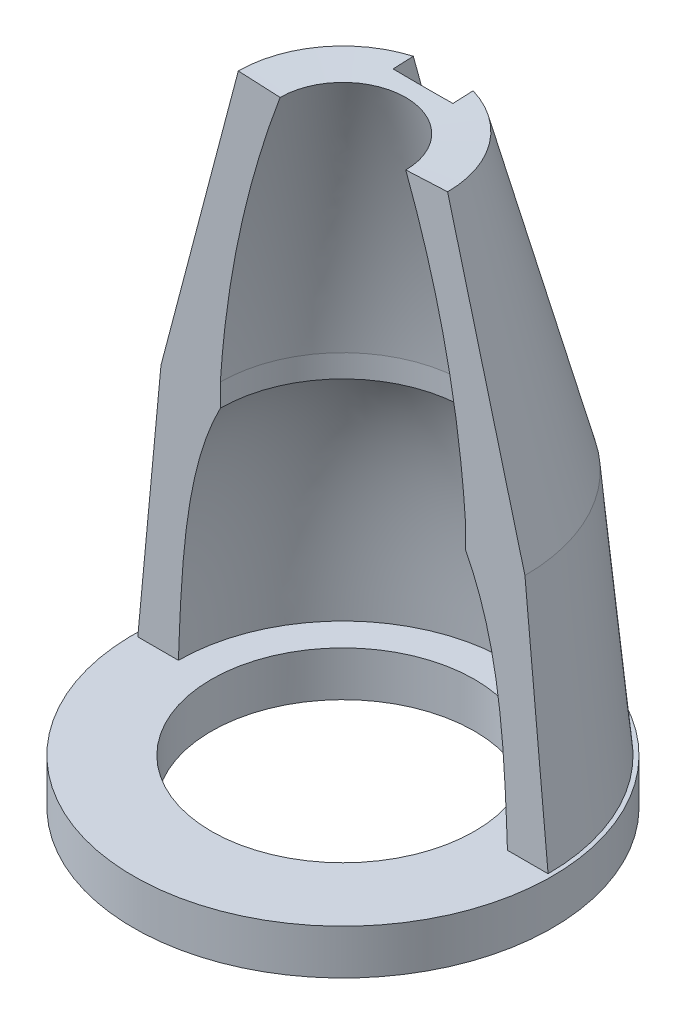
ISO-10303-21;
HEADER;
FILE_DESCRIPTION(('STEP AP214'),'2;1');
FILE_NAME('part.step','',(''),(''),'','','');
FILE_SCHEMA(('AUTOMOTIVE_DESIGN { 1 0 10303 214 1 1 1 1 }'));
ENDSEC;
DATA;
#1=APPLICATION_CONTEXT('core data for automotive mechanical design processes');
#2=APPLICATION_PROTOCOL_DEFINITION('international standard','automotive_design',2000,#1);
#3=PRODUCT_CONTEXT('',#1,'mechanical');
#4=PRODUCT('Part','Part','',(#3));
#5=PRODUCT_RELATED_PRODUCT_CATEGORY('part','',(#4));
#6=PRODUCT_DEFINITION_FORMATION('','',#4);
#7=PRODUCT_DEFINITION_CONTEXT('part definition',#1,'design');
#8=PRODUCT_DEFINITION('design','',#6,#7);
#9=PRODUCT_DEFINITION_SHAPE('','',#8);
#10=(LENGTH_UNIT() NAMED_UNIT(*) SI_UNIT(.MILLI.,.METRE.));
#11=(NAMED_UNIT(*) PLANE_ANGLE_UNIT() SI_UNIT($,.RADIAN.));
#12=(NAMED_UNIT(*) SI_UNIT($,.STERADIAN.) SOLID_ANGLE_UNIT());
#13=UNCERTAINTY_MEASURE_WITH_UNIT(LENGTH_MEASURE(1.E-05),#10,'distance_accuracy_value','');
#14=(GEOMETRIC_REPRESENTATION_CONTEXT(3) GLOBAL_UNCERTAINTY_ASSIGNED_CONTEXT((#13)) GLOBAL_UNIT_ASSIGNED_CONTEXT((#10,
#11,#12)) REPRESENTATION_CONTEXT('',''));
#15=CARTESIAN_POINT('',(0.,0.,0.));
#16=DIRECTION('',(0.,0.,1.));
#17=DIRECTION('',(1.,0.,0.));
#18=AXIS2_PLACEMENT_3D('',#15,#16,#17);
#19=CARTESIAN_POINT('',(0.,9.74930861182992,0.));
#20=DIRECTION('',(0.,-1.,0.));
#21=DIRECTION('',(0.,0.,-1.));
#22=AXIS2_PLACEMENT_3D('',#19,#20,#21);
#23=CONICAL_SURFACE('',#22,6.08440046766459,0.257573905962779);
#24=CARTESIAN_POINT('',(0.,19.5659579235041,0.));
#25=DIRECTION('',(0.,-1.,0.));
#26=DIRECTION('',(0.,0.,-1.));
#27=AXIS2_PLACEMENT_3D('',#24,#25,#26);
#28=CIRCLE('',#27,3.49844540555827);
#29=CARTESIAN_POINT('',(-3.49844540555827,19.5659579235041,0.));
#30=VERTEX_POINT('',#29);
#31=CARTESIAN_POINT('',(-1.,19.5659579235041,-3.35247971741393));
#32=VERTEX_POINT('',#31);
#33=EDGE_CURVE('E324',#30,#32,#28,.T.);
#34=ORIENTED_EDGE('',*,*,#33,.T.);
#35=CARTESIAN_POINT('',(-1.,1.59736562952712,8.17086395291741));
#36=CARTESIAN_POINT('',(-1.,2.65581479317755,7.8899438466046));
#37=CARTESIAN_POINT('',(-1.,3.71421910526494,7.60885422320191));
#38=CARTESIAN_POINT('',(-1.,5.83091224108039,7.0461050256498));
#39=CARTESIAN_POINT('',(-1.,6.8892010600612,6.76444543364683));
#40=CARTESIAN_POINT('',(-1.,9.00233260573966,6.20120615008545));
#41=CARTESIAN_POINT('',(-1.,10.0571759698104,5.91962885044428));
#42=CARTESIAN_POINT('',(-1.,12.1665160028534,5.35530733737491));
#43=CARTESIAN_POINT('',(-1.,13.2210126815091,5.0725631601803));
#44=CARTESIAN_POINT('',(-1.,15.0459133065507,4.58146423670634));
#45=CARTESIAN_POINT('',(-1.,15.8164377232071,4.3735572983072));
#46=CARTESIAN_POINT('',(-1.,17.357130458585,3.9561742214183));
#47=CARTESIAN_POINT('',(-1.,18.1272987426996,3.74669795493429));
#48=CARTESIAN_POINT('',(-1.,19.283011686943,3.43030638536026));
#49=CARTESIAN_POINT('',(-1.,19.6688169704537,3.32434353402257));
#50=CARTESIAN_POINT('',(-1.,20.4401908888034,3.11156038696217));
#51=CARTESIAN_POINT('',(-1.,20.8257595238109,3.00474009185115));
#52=CARTESIAN_POINT('',(-1.,21.5964705959809,2.78996406923584));
#53=CARTESIAN_POINT('',(-1.,21.9816131191467,2.68200865086172));
#54=CARTESIAN_POINT('',(-1.,22.7514274274367,2.46444565502901));
#55=CARTESIAN_POINT('',(-1.,23.1360992173402,2.35483809449763));
#56=CARTESIAN_POINT('',(-1.,23.9050602683575,2.13308453982012));
#57=CARTESIAN_POINT('',(-1.,24.2893489472598,2.02093651494733));
#58=CARTESIAN_POINT('',(-1.,24.8650472593894,1.84968242406842));
#59=CARTESIAN_POINT('',(-1.,25.0569003962659,1.79206886901678));
#60=CARTESIAN_POINT('',(-1.,25.4401906226309,1.67551333823383));
#61=CARTESIAN_POINT('',(-1.,25.6316277378972,1.61657144754172));
#62=CARTESIAN_POINT('',(-1.,26.0132650308753,1.49708294523809));
#63=CARTESIAN_POINT('',(-1.,26.2034671922711,1.43654268174371));
#64=CARTESIAN_POINT('',(-1.,26.5830939911822,1.31289144150961));
#65=CARTESIAN_POINT('',(-1.,26.7725184255981,1.24977983510996));
#66=CARTESIAN_POINT('',(-1.,27.0555227814339,1.1522124090513));
#67=CARTESIAN_POINT('',(-1.,27.1496094609985,1.11922846206743));
#68=CARTESIAN_POINT('',(-1.,27.3373299367616,1.05199885243392));
#69=CARTESIAN_POINT('',(-1.,27.4309637464336,1.01775322758538));
#70=CARTESIAN_POINT('',(-1.,27.6175725161607,0.947618629059525));
#71=CARTESIAN_POINT('',(-1.,27.7105477273507,0.911730325578836));
#72=CARTESIAN_POINT('',(-1.,27.8955928089887,0.837699605368933));
#73=CARTESIAN_POINT('',(-1.,27.9876628110541,0.799557522166223));
#74=CARTESIAN_POINT('',(-1.,28.1149603301852,0.744122129188133));
#75=CARTESIAN_POINT('',(-1.,28.1507917585206,0.728216078192626));
#76=CARTESIAN_POINT('',(-1.,28.2221811160255,0.695792557199093));
#77=CARTESIAN_POINT('',(-1.,28.2577390195709,0.679275030740112));
#78=CARTESIAN_POINT('',(-1.,28.3639384278884,0.628623160375121));
#79=CARTESIAN_POINT('',(-1.,28.4340687423826,0.593405311256645));
#80=CARTESIAN_POINT('',(-1.,28.5673174912212,0.521203502611795));
#81=CARTESIAN_POINT('',(-1.,28.6305864667807,0.484507548657398));
#82=CARTESIAN_POINT('',(-1.,28.7226069352826,0.424833248916426));
#83=CARTESIAN_POINT('',(-1.,28.7528312418735,0.404145042904418));
#84=CARTESIAN_POINT('',(-1.,28.8117426580728,0.3607040580166));
#85=CARTESIAN_POINT('',(-1.,28.840431383961,0.337953520632389));
#86=CARTESIAN_POINT('',(-1.,28.8957077274827,0.289334265110898));
#87=CARTESIAN_POINT('',(-1.,28.9222647414958,0.263430253827442));
#88=CARTESIAN_POINT('',(-1.,28.9707739450115,0.207666063401883));
#89=CARTESIAN_POINT('',(-1.,28.9927614121425,0.177839336527438));
#90=CARTESIAN_POINT('',(-1.,29.0183465969364,0.131026100614901));
#91=CARTESIAN_POINT('',(-1.,29.0254162509004,0.115969692344692));
#92=CARTESIAN_POINT('',(-1.,29.0371858920895,0.0849479585539478));
#93=CARTESIAN_POINT('',(-1.,29.0418883259105,0.0689835905158777));
#94=CARTESIAN_POINT('',(-1.,29.0484162607216,0.0362975679000318));
#95=CARTESIAN_POINT('',(-1.,29.0502139261186,0.0195701476017675));
#96=CARTESIAN_POINT('',(-1.,29.0505723188851,-0.0139212100134694));
#97=CARTESIAN_POINT('',(-1.,29.0491332049211,-0.0306851455002256));
#98=CARTESIAN_POINT('',(-1.,29.0435433648495,-0.06196601172763));
#99=CARTESIAN_POINT('',(-1.,29.0396845176397,-0.0765375991467143));
#100=CARTESIAN_POINT('',(-1.,29.0299295012471,-0.104971903732398));
#101=CARTESIAN_POINT('',(-1.,29.0240322897983,-0.1188342540775));
#102=CARTESIAN_POINT('',(-1.,29.0055127304719,-0.156041867479906));
#103=CARTESIAN_POINT('',(-1.,28.9911956344389,-0.178535167169328));
#104=CARTESIAN_POINT('',(-1.,28.9594519307908,-0.221212467860429));
#105=CARTESIAN_POINT('',(-1.,28.9420134144246,-0.241387120955779));
#106=CARTESIAN_POINT('',(-1.,28.8969830563985,-0.288431447871601));
#107=CARTESIAN_POINT('',(-1.,28.8683324051545,-0.314272421634982));
#108=CARTESIAN_POINT('',(-1.,28.8087365384255,-0.363196308592947));
#109=CARTESIAN_POINT('',(-1.,28.777785975982,-0.386272446873958));
#110=CARTESIAN_POINT('',(-1.,28.7142836425353,-0.430521784200716));
#111=CARTESIAN_POINT('',(-1.,28.681723205757,-0.451682427128373));
#112=CARTESIAN_POINT('',(-1.,28.6156941820293,-0.492421782998218));
#113=CARTESIAN_POINT('',(-1.,28.5822267449263,-0.51200238423207));
#114=CARTESIAN_POINT('',(-1.,28.472651524924,-0.573573130774992));
#115=CARTESIAN_POINT('',(-1.,28.3952156168386,-0.613188023375372));
#116=CARTESIAN_POINT('',(-1.,28.2385793715012,-0.688790200872645));
#117=CARTESIAN_POINT('',(-1.,28.1593778171492,-0.724774882647809));
#118=CARTESIAN_POINT('',(-1.,27.9997013149153,-0.794319374942134));
#119=CARTESIAN_POINT('',(-1.,27.9192238270734,-0.827873331750471));
#120=CARTESIAN_POINT('',(-1.,27.7575677635494,-0.893156914301305));
#121=CARTESIAN_POINT('',(-1.,27.6763894109428,-0.92488709756774));
#122=CARTESIAN_POINT('',(-1.,27.5135717361275,-0.98695634022298));
#123=CARTESIAN_POINT('',(-1.,27.4319327902324,-1.01729639019937));
#124=CARTESIAN_POINT('',(-1.,27.2682622589641,-1.07691385873241));
#125=CARTESIAN_POINT('',(-1.,27.1862306445427,-1.10619119725415));
#126=CARTESIAN_POINT('',(-1.,27.0219838685205,-1.163854581408));
#127=CARTESIAN_POINT('',(-1.,26.9397691223436,-1.19224181290881));
#128=CARTESIAN_POINT('',(-1.,26.7751062186691,-1.24832164738761));
#129=CARTESIAN_POINT('',(-1.,26.6926580679848,-1.27601427041421));
#130=CARTESIAN_POINT('',(-1.,26.4463481695884,-1.35779815628005));
#131=CARTESIAN_POINT('',(-1.,26.2822082432315,-1.41105147735648));
#132=CARTESIAN_POINT('',(-1.,25.9534134268894,-1.5159468254333));
#133=CARTESIAN_POINT('',(-1.,25.788758526161,-1.56758881856896));
#134=CARTESIAN_POINT('',(-1.,25.2942184621035,-1.72073435838425));
#135=CARTESIAN_POINT('',(-1.,24.9637804048912,-1.82045015018727));
#136=CARTESIAN_POINT('',(-1.,24.3018146239546,-2.01707265538576));
#137=CARTESIAN_POINT('',(-1.,23.9702862816997,-2.11397726907767));
#138=CARTESIAN_POINT('',(-1.,23.3066847855066,-2.30585080421032));
#139=CARTESIAN_POINT('',(-1.,22.9746116536514,-2.4008198021138));
#140=CARTESIAN_POINT('',(-1.,22.3106495012682,-2.5892468400219));
#141=CARTESIAN_POINT('',(-1.,21.9787611318818,-2.68270717976484));
#142=CARTESIAN_POINT('',(-1.,21.3147047169263,-2.86864098330493));
#143=CARTESIAN_POINT('',(-1.,20.9825366685703,-2.9611144371397));
#144=CARTESIAN_POINT('',(-1.,19.9859228616788,-3.23737750993922));
#145=CARTESIAN_POINT('',(-1.,19.3211718052259,-3.42006500426242));
#146=CARTESIAN_POINT('',(-1.,17.8492790408652,-3.82245813232542));
#147=CARTESIAN_POINT('',(-1.,17.0420228908798,-4.04174414556835));
#148=CARTESIAN_POINT('',(-1.,15.4270772238621,-4.47871990123849));
#149=CARTESIAN_POINT('',(-1.,14.6193877058832,-4.69640964016443));
#150=CARTESIAN_POINT('',(-1.,13.003624554938,-5.13076662003794));
#151=CARTESIAN_POINT('',(-1.,12.195550886334,-5.3474337283251));
#152=CARTESIAN_POINT('',(-1.,10.5792090186622,-5.78004121159687));
#153=CARTESIAN_POINT('',(-1.,9.77094081957183,-5.99598158649754));
#154=CARTESIAN_POINT('',(-1.,8.15265545501148,-6.42776758895207));
#155=CARTESIAN_POINT('',(-1.,7.34263801096158,-6.64361217213717));
#156=CARTESIAN_POINT('',(-1.,5.72249856165326,-7.07490939286829));
#157=CARTESIAN_POINT('',(-1.,4.91237655636603,-7.29036203030603));
#158=CARTESIAN_POINT('',(-1.,3.29216287235672,-7.72093931242668));
#159=CARTESIAN_POINT('',(-1.,2.48207120438845,-7.93606399758119));
#160=CARTESIAN_POINT('',(-1.,0.861825221954424,-8.36607611551925));
#161=CARTESIAN_POINT('',(-1.,0.0516709075121448,-8.58096354839122));
#162=CARTESIAN_POINT('',(-1.,-0.75850666456266,-8.79576318447279));
#163=B_SPLINE_CURVE_WITH_KNOTS('',3,(#35,#36,#37,#38,#39,#40,#41,#42,#43,#44,#45,#46,#47,#48,
#49,#50,#51,#52,#53,#54,#55,#56,#57,#58,#59,#60,#61,#62,#63,#64,#65,#66,#67,#68,#69,#70,#71,#72,
#73,#74,#75,#76,#77,#78,#79,#80,#81,#82,#83,#84,#85,#86,#87,#88,#89,#90,#91,#92,#93,#94,#95,#96,
#97,#98,#99,#100,#101,#102,#103,#104,#105,#106,#107,#108,#109,#110,#111,#112,#113,#114,#115,
#116,#117,#118,#119,#120,#121,#122,#123,#124,#125,#126,#127,#128,#129,#130,#131,#132,#133,#134,
#135,#136,#137,#138,#139,#140,#141,#142,#143,#144,#145,#146,#147,#148,#149,#150,#151,#152,#153,
#154,#155,#156,#157,#158,#159,#160,#161,#162),.UNSPECIFIED.,.F.,.F.,(4,2,2,2,2,2,2,2,2,2,2,2,2,
2,2,2,2,2,2,2,2,2,2,2,2,2,2,2,2,2,2,2,2,2,2,2,2,2,2,2,2,2,2,2,2,2,2,2,2,2,2,2,2,2,2,2,2,2,2,2,2,
2,2,4),(0.,3.28528201965727,6.57066859081754,9.84600374826942,13.1212379547922,15.5154799493153,
17.9099193913156,19.1101955494143,20.3104708513309,21.5104273360822,22.7103715348884,
23.9113113489673,24.5122594209438,25.1131691292835,25.7119728076043,26.3109240103574,
26.610019979206,26.9091069941223,27.2080730536215,27.5069949807755,27.6245999434365,
27.7422157924407,27.9775677782348,28.1967348240543,28.3065576394288,28.4162624906756,
28.5273330893305,28.6375114373154,28.6872596087236,28.7369562577369,28.7871263708053,
28.8372940245916,28.8823392039849,28.9274074502487,29.006929052421,29.0867607734272,
29.2022088691137,29.3179343095752,29.4343704159261,29.5506652437667,29.8114141012395,
30.0723486248167,30.3338919715925,30.5953549351339,30.8566285905307,31.1179218823111,
31.3788508346829,31.6397722471268,32.1574464105727,32.6751314464767,33.7105723969808,
34.7467677957353,35.782922181963,36.8173102458488,37.8517087417907,39.9198959460724,
42.4294233577757,44.9389562722251,47.4488062487425,49.9586565151591,52.4735031615768,
54.9883505025708,57.5028572277418,60.0173630153837),.UNSPECIFIED.);
#164=CARTESIAN_POINT('',(-1.,9.74930861182994,-6.00166052446463));
#165=VERTEX_POINT('',#164);
#166=EDGE_CURVE('E49',#32,#165,#163,.T.);
#167=ORIENTED_EDGE('',*,*,#166,.T.);
#168=CARTESIAN_POINT('',(0.,9.74930861182992,0.));
#169=DIRECTION('',(0.,-1.,0.));
#170=DIRECTION('',(0.,0.,-1.));
#171=AXIS2_PLACEMENT_3D('',#168,#169,#170);
#172=CIRCLE('',#171,6.08440046766459);
#173=CARTESIAN_POINT('',(-6.08440046766459,9.74930861182992,0.));
#174=VERTEX_POINT('',#173);
#175=EDGE_CURVE('E212',#174,#165,#172,.T.);
#176=ORIENTED_EDGE('',*,*,#175,.F.);
#177=DIRECTION('',(0.254735244649564,0.967010835065113,0.));
#178=VECTOR('',#177,1.);
#179=CARTESIAN_POINT('',(-6.08440046766459,9.74930861182992,0.));
#180=LINE('',#179,#178);
#181=EDGE_CURVE('E264',#174,#30,#180,.T.);
#182=ORIENTED_EDGE('',*,*,#181,.T.);
#183=EDGE_LOOP('',(#34,#167,#176,#182));
#184=FACE_BOUND('',#183,.T.);
#185=ADVANCED_FACE('F33',(#184),#23,.T.);
#186=CARTESIAN_POINT('',(0.,0.,0.));
#187=DIRECTION('',(0.,-1.,0.));
#188=DIRECTION('',(0.,0.,-1.));
#189=AXIS2_PLACEMENT_3D('',#186,#187,#188);
#190=CONICAL_SURFACE('',#189,7.,0.0936396511303337);
#191=CARTESIAN_POINT('',(1.,14.969992515671,-5.50399807245972));
#192=CARTESIAN_POINT('',(1.,13.2724525543383,-5.66602543122509));
#193=CARTESIAN_POINT('',(1.,11.5748920773463,-5.82783764689055));
#194=CARTESIAN_POINT('',(1.,8.1797374498491,-6.15110805088424));
#195=CARTESIAN_POINT('',(1.,6.4821432993447,-6.31256623922032));
#196=CARTESIAN_POINT('',(1.,3.82979410705182,-6.56461223587331));
#197=CARTESIAN_POINT('',(1.,2.8750480870203,-6.6552949970699));
#198=CARTESIAN_POINT('',(1.,1.92029854436637,-6.74594061357374));
#199=B_SPLINE_CURVE_WITH_KNOTS('',3,(#191,#192,#193,#194,#195,#196,#197,#198),.UNSPECIFIED.,.F.,
.F.,(4,2,2,4),(0.,5.11576510781106,10.231530102274,13.1086588610301),.UNSPECIFIED.);
#200=CARTESIAN_POINT('',(1.,9.74930861182994,-6.00166052446463));
#201=VERTEX_POINT('',#200);
#202=CARTESIAN_POINT('',(1.,7.14098244820744,-6.24986343805771));
#203=VERTEX_POINT('',#202);
#204=EDGE_CURVE('E207',#201,#203,#199,.T.);
#205=ORIENTED_EDGE('',*,*,#204,.F.);
#206=CARTESIAN_POINT('',(6.08440046766459,9.74930861182992,0.));
#207=VERTEX_POINT('',#206);
#208=EDGE_CURVE('E322',#201,#207,#172,.T.);
#209=ORIENTED_EDGE('',*,*,#208,.T.);
#210=DIRECTION('',(-0.0935028663726001,0.995619010455359,0.));
#211=VECTOR('',#210,1.);
#212=CARTESIAN_POINT('',(7.,0.,0.));
#213=LINE('',#212,#211);
#214=CARTESIAN_POINT('',(6.85912854406551,1.5,0.));
#215=VERTEX_POINT('',#214);
#216=EDGE_CURVE('E236',#215,#207,#213,.T.);
#217=ORIENTED_EDGE('',*,*,#216,.F.);
#218=CARTESIAN_POINT('',(0.,1.5,0.));
#219=DIRECTION('',(0.,-1.,0.));
#220=DIRECTION('',(0.,0.,-1.));
#221=AXIS2_PLACEMENT_3D('',#218,#219,#220);
#222=CIRCLE('',#221,6.85912854406551);
#223=CARTESIAN_POINT('',(-6.85912854406551,1.5,0.));
#224=VERTEX_POINT('',#223);
#225=EDGE_CURVE('E233',#215,#224,#222,.F.);
#226=ORIENTED_EDGE('',*,*,#225,.T.);
#227=DIRECTION('',(0.0935028663726001,0.995619010455359,0.));
#228=VECTOR('',#227,1.);
#229=CARTESIAN_POINT('',(-7.,0.,0.));
#230=LINE('',#229,#228);
#231=EDGE_CURVE('E259',#224,#174,#230,.T.);
#232=ORIENTED_EDGE('',*,*,#231,.T.);
#233=ORIENTED_EDGE('',*,*,#175,.T.);
#234=CARTESIAN_POINT('',(-1.,14.969992515671,-5.50399807245971));
#235=CARTESIAN_POINT('',(-1.,13.2724525543384,-5.66602543122508));
#236=CARTESIAN_POINT('',(-1.,11.5748920773463,-5.82783764689054));
#237=CARTESIAN_POINT('',(-1.,8.17973744984911,-6.15110805088424));
#238=CARTESIAN_POINT('',(-1.,6.48214329934471,-6.31256623922031));
#239=CARTESIAN_POINT('',(-1.,3.82979410705182,-6.56461223587331));
#240=CARTESIAN_POINT('',(-1.,2.8750480870203,-6.6552949970699));
#241=CARTESIAN_POINT('',(-1.,1.92029854436637,-6.74594061357374));
#242=B_SPLINE_CURVE_WITH_KNOTS('',3,(#234,#235,#236,#237,#238,#239,#240,#241),.UNSPECIFIED.,.F.,
.F.,(4,2,2,4),(0.,5.11576510781106,10.231530102274,13.1086588610301),.UNSPECIFIED.);
#243=CARTESIAN_POINT('',(-1.,7.14098244820744,-6.24986343805771));
#244=VERTEX_POINT('',#243);
#245=EDGE_CURVE('E155',#165,#244,#242,.T.);
#246=ORIENTED_EDGE('',*,*,#245,.T.);
#247=CARTESIAN_POINT('',(0.,7.14098244820744,0.));
#248=DIRECTION('',(0.,1.,0.));
#249=DIRECTION('',(0.,0.,1.));
#250=AXIS2_PLACEMENT_3D('',#247,#248,#249);
#251=CIRCLE('',#250,6.32935960381226);
#252=EDGE_CURVE('E11',#244,#203,#251,.F.);
#253=ORIENTED_EDGE('',*,*,#252,.T.);
#254=EDGE_LOOP('',(#205,#209,#217,#226,#232,#233,#246,#253));
#255=FACE_BOUND('',#254,.T.);
#256=ADVANCED_FACE('F35',(#255),#190,.T.);
#257=CARTESIAN_POINT('',(-3.44296880345594,14.9548942200731,0.));
#258=DIRECTION('',(0.,0.,-1.));
#259=DIRECTION('',(-1.,0.,0.));
#260=AXIS2_PLACEMENT_3D('',#257,#258,#259);
#261=PLANE('',#260);
#262=DIRECTION('',(-1.,0.,0.));
#263=VECTOR('',#262,1.);
#264=CARTESIAN_POINT('',(-3.44296880345594,1.5,0.));
#265=LINE('',#264,#263);
#266=CARTESIAN_POINT('',(5.5,1.5,0.));
#267=VERTEX_POINT('',#266);
#268=EDGE_CURVE('E57',#215,#267,#265,.T.);
#269=ORIENTED_EDGE('',*,*,#268,.F.);
#270=ORIENTED_EDGE('',*,*,#216,.T.);
#271=DIRECTION('',(-0.254735244649564,0.967010835065113,0.));
#272=VECTOR('',#271,1.);
#273=CARTESIAN_POINT('',(6.08440046766459,9.74930861182992,0.));
#274=LINE('',#273,#272);
#275=CARTESIAN_POINT('',(3.49844540555827,19.5659579235041,0.));
#276=VERTEX_POINT('',#275);
#277=EDGE_CURVE('E238',#207,#276,#274,.T.);
#278=ORIENTED_EDGE('',*,*,#277,.T.);
#279=DIRECTION('',(-0.998889575398763,-0.0471128025029148,0.));
#280=VECTOR('',#279,1.);
#281=CARTESIAN_POINT('',(2.1,19.5,0.));
#282=LINE('',#281,#280);
#283=CARTESIAN_POINT('',(2.1,19.5,0.));
#284=VERTEX_POINT('',#283);
#285=EDGE_CURVE('E241',#276,#284,#282,.T.);
#286=ORIENTED_EDGE('',*,*,#285,.T.);
#287=CARTESIAN_POINT('',(2.1,19.5,0.));
#288=CARTESIAN_POINT('',(3.78593760691189,15.0302924287003,0.));
#289=CARTESIAN_POINT('',(4.1,10.2589920228917,0.));
#290=B_SPLINE_CURVE_WITH_KNOTS('',2,(#287,#288,#289),.UNSPECIFIED.,.F.,.F.,(3,3),(0.,1.),.UNSPECIFIED.);
#291=CARTESIAN_POINT('',(4.1,10.2589920228917,0.));
#292=VERTEX_POINT('',#291);
#293=EDGE_CURVE('E244',#284,#292,#290,.T.);
#294=ORIENTED_EDGE('',*,*,#293,.T.);
#295=DIRECTION('',(0.,-1.,0.));
#296=VECTOR('',#295,1.);
#297=CARTESIAN_POINT('',(4.1,9.5,0.));
#298=LINE('',#297,#296);
#299=CARTESIAN_POINT('',(4.1,9.5,0.));
#300=VERTEX_POINT('',#299);
#301=EDGE_CURVE('E249',#292,#300,#298,.T.);
#302=ORIENTED_EDGE('',*,*,#301,.T.);
#303=CARTESIAN_POINT('',(4.1,9.5,0.));
#304=CARTESIAN_POINT('',(5.28892425324943,7.20013957910176,0.));
#305=CARTESIAN_POINT('',(5.39457491137695,4.30480440974699,0.));
#306=CARTESIAN_POINT('',(5.5,1.5,0.));
#307=B_SPLINE_CURVE_WITH_KNOTS('',3,(#303,#304,#305,#306),.UNSPECIFIED.,.F.,.F.,(4,4),(0.,
0.667768353532462),.UNSPECIFIED.);
#308=EDGE_CURVE('E255',#300,#267,#307,.T.);
#309=ORIENTED_EDGE('',*,*,#308,.T.);
#310=EDGE_LOOP('',(#269,#270,#278,#286,#294,#302,#309));
#311=FACE_BOUND('',#310,.T.);
#312=ADVANCED_FACE('F311',(#311),#261,.F.);
#313=CARTESIAN_POINT('',(-5.5,1.5,0.));
#314=VERTEX_POINT('',#313);
#315=EDGE_CURVE('E180',#314,#224,#265,.T.);
#316=ORIENTED_EDGE('',*,*,#315,.F.);
#317=CARTESIAN_POINT('',(-4.1,9.5,0.));
#318=CARTESIAN_POINT('',(-5.28892425324943,7.20013957910176,0.));
#319=CARTESIAN_POINT('',(-5.39457491137695,4.30480440974699,0.));
#320=CARTESIAN_POINT('',(-5.5,1.5,0.));
#321=B_SPLINE_CURVE_WITH_KNOTS('',3,(#317,#318,#319,#320),.UNSPECIFIED.,.F.,.F.,(4,4),(0.,
0.667768353532462),.UNSPECIFIED.);
#322=CARTESIAN_POINT('',(-4.1,9.5,0.));
#323=VERTEX_POINT('',#322);
#324=EDGE_CURVE('E281',#323,#314,#321,.T.);
#325=ORIENTED_EDGE('',*,*,#324,.F.);
#326=DIRECTION('',(0.,-1.,0.));
#327=VECTOR('',#326,1.);
#328=CARTESIAN_POINT('',(-4.1,9.5,0.));
#329=LINE('',#328,#327);
#330=CARTESIAN_POINT('',(-4.1,10.2589920228917,0.));
#331=VERTEX_POINT('',#330);
#332=EDGE_CURVE('E275',#331,#323,#329,.T.);
#333=ORIENTED_EDGE('',*,*,#332,.F.);
#334=CARTESIAN_POINT('',(-2.1,19.5,0.));
#335=CARTESIAN_POINT('',(-3.78593760691189,15.0302924287003,0.));
#336=CARTESIAN_POINT('',(-4.1,10.2589920228917,0.));
#337=B_SPLINE_CURVE_WITH_KNOTS('',2,(#334,#335,#336),.UNSPECIFIED.,.F.,.F.,(3,3),(0.,1.),.UNSPECIFIED.);
#338=CARTESIAN_POINT('',(-2.1,19.5,0.));
#339=VERTEX_POINT('',#338);
#340=EDGE_CURVE('E269',#339,#331,#337,.T.);
#341=ORIENTED_EDGE('',*,*,#340,.F.);
#342=DIRECTION('',(0.998889575398763,-0.0471128025029148,0.));
#343=VECTOR('',#342,1.);
#344=CARTESIAN_POINT('',(-2.1,19.5,0.));
#345=LINE('',#344,#343);
#346=EDGE_CURVE('E267',#30,#339,#345,.T.);
#347=ORIENTED_EDGE('',*,*,#346,.F.);
#348=ORIENTED_EDGE('',*,*,#181,.F.);
#349=ORIENTED_EDGE('',*,*,#231,.F.);
#350=EDGE_LOOP('',(#316,#325,#333,#341,#347,#348,#349));
#351=FACE_BOUND('',#350,.T.);
#352=ADVANCED_FACE('F313',(#351),#261,.F.);
#353=CARTESIAN_POINT('',(1.,1.59736562952712,8.17086395291741));
#354=CARTESIAN_POINT('',(1.,2.65581479317755,7.8899438466046));
#355=CARTESIAN_POINT('',(1.,3.71421910526494,7.60885422320191));
#356=CARTESIAN_POINT('',(1.,5.83091224108039,7.0461050256498));
#357=CARTESIAN_POINT('',(1.,6.8892010600612,6.76444543364683));
#358=CARTESIAN_POINT('',(1.,9.00233260573966,6.20120615008545));
#359=CARTESIAN_POINT('',(1.,10.0571759698104,5.91962885044428));
#360=CARTESIAN_POINT('',(1.,12.1665160028534,5.35530733737491));
#361=CARTESIAN_POINT('',(1.,13.2210126815091,5.0725631601803));
#362=CARTESIAN_POINT('',(1.,15.0459133065507,4.58146423670634));
#363=CARTESIAN_POINT('',(1.,15.8164377232071,4.3735572983072));
#364=CARTESIAN_POINT('',(1.,17.357130458585,3.9561742214183));
#365=CARTESIAN_POINT('',(1.,18.1272987426996,3.74669795493429));
#366=CARTESIAN_POINT('',(1.,19.283011686943,3.43030638536026));
#367=CARTESIAN_POINT('',(1.,19.6688169704537,3.32434353402257));
#368=CARTESIAN_POINT('',(1.,20.4401908888034,3.11156038696217));
#369=CARTESIAN_POINT('',(1.,20.8257595238109,3.00474009185115));
#370=CARTESIAN_POINT('',(1.,21.5964705959809,2.78996406923584));
#371=CARTESIAN_POINT('',(1.,21.9816131191467,2.68200865086172));
#372=CARTESIAN_POINT('',(1.,22.7514274274367,2.46444565502901));
#373=CARTESIAN_POINT('',(1.,23.1360992173402,2.35483809449763));
#374=CARTESIAN_POINT('',(1.,23.9050602683575,2.13308453982012));
#375=CARTESIAN_POINT('',(1.,24.2893489472598,2.02093651494733));
#376=CARTESIAN_POINT('',(1.,24.8650472593894,1.84968242406842));
#377=CARTESIAN_POINT('',(1.,25.0569003962659,1.79206886901678));
#378=CARTESIAN_POINT('',(1.,25.4401906226309,1.67551333823383));
#379=CARTESIAN_POINT('',(1.,25.6316277378972,1.61657144754172));
#380=CARTESIAN_POINT('',(1.,26.0132650308753,1.49708294523809));
#381=CARTESIAN_POINT('',(1.,26.2034671922711,1.43654268174371));
#382=CARTESIAN_POINT('',(1.,26.5830939911822,1.31289144150961));
#383=CARTESIAN_POINT('',(1.,26.7725184255981,1.24977983510996));
#384=CARTESIAN_POINT('',(1.,27.0555227814339,1.1522124090513));
#385=CARTESIAN_POINT('',(1.,27.1496094609985,1.11922846206743));
#386=CARTESIAN_POINT('',(1.,27.3373299367616,1.05199885243392));
#387=CARTESIAN_POINT('',(1.,27.4309637464336,1.01775322758538));
#388=CARTESIAN_POINT('',(1.,27.6175725161607,0.947618629059525));
#389=CARTESIAN_POINT('',(1.,27.7105477273507,0.911730325578836));
#390=CARTESIAN_POINT('',(1.,27.8955928089887,0.837699605368933));
#391=CARTESIAN_POINT('',(1.,27.9876628110541,0.799557522166223));
#392=CARTESIAN_POINT('',(1.,28.1149603301852,0.744122129188133));
#393=CARTESIAN_POINT('',(1.,28.1507917585206,0.728216078192626));
#394=CARTESIAN_POINT('',(1.,28.2221811160255,0.695792557199093));
#395=CARTESIAN_POINT('',(1.,28.2577390195709,0.679275030740112));
#396=CARTESIAN_POINT('',(1.,28.3639384278884,0.628623160375121));
#397=CARTESIAN_POINT('',(1.,28.4340687423826,0.593405311256645));
#398=CARTESIAN_POINT('',(1.,28.5673174912212,0.521203502611795));
#399=CARTESIAN_POINT('',(1.,28.6305864667807,0.484507548657398));
#400=CARTESIAN_POINT('',(1.,28.7226069352826,0.424833248916426));
#401=CARTESIAN_POINT('',(1.,28.7528312418735,0.404145042904418));
#402=CARTESIAN_POINT('',(1.,28.8117426580728,0.3607040580166));
#403=CARTESIAN_POINT('',(1.,28.840431383961,0.337953520632389));
#404=CARTESIAN_POINT('',(1.,28.8957077274827,0.289334265110898));
#405=CARTESIAN_POINT('',(1.,28.9222647414958,0.263430253827442));
#406=CARTESIAN_POINT('',(1.,28.9707739450115,0.207666063401883));
#407=CARTESIAN_POINT('',(1.,28.9927614121425,0.177839336527438));
#408=CARTESIAN_POINT('',(1.,29.0183465969364,0.131026100614901));
#409=CARTESIAN_POINT('',(1.,29.0254162509004,0.115969692344692));
#410=CARTESIAN_POINT('',(1.,29.0371858920895,0.0849479585539478));
#411=CARTESIAN_POINT('',(1.,29.0418883259105,0.0689835905158777));
#412=CARTESIAN_POINT('',(1.,29.0484162607216,0.0362975679000318));
#413=CARTESIAN_POINT('',(1.,29.0502139261186,0.0195701476017675));
#414=CARTESIAN_POINT('',(1.,29.0505723188851,-0.0139212100134694));
#415=CARTESIAN_POINT('',(1.,29.0491332049211,-0.0306851455002256));
#416=CARTESIAN_POINT('',(1.,29.0435433648495,-0.06196601172763));
#417=CARTESIAN_POINT('',(1.,29.0396845176397,-0.0765375991467143));
#418=CARTESIAN_POINT('',(1.,29.0299295012471,-0.104971903732398));
#419=CARTESIAN_POINT('',(1.,29.0240322897983,-0.1188342540775));
#420=CARTESIAN_POINT('',(1.,29.0055127304719,-0.156041867479906));
#421=CARTESIAN_POINT('',(1.,28.9911956344389,-0.178535167169328));
#422=CARTESIAN_POINT('',(1.,28.9594519307908,-0.221212467860429));
#423=CARTESIAN_POINT('',(1.,28.9420134144246,-0.241387120955779));
#424=CARTESIAN_POINT('',(1.,28.8969830563985,-0.288431447871601));
#425=CARTESIAN_POINT('',(1.,28.8683324051545,-0.314272421634982));
#426=CARTESIAN_POINT('',(1.,28.8087365384255,-0.363196308592947));
#427=CARTESIAN_POINT('',(1.,28.777785975982,-0.386272446873958));
#428=CARTESIAN_POINT('',(1.,28.7142836425353,-0.430521784200716));
#429=CARTESIAN_POINT('',(1.,28.681723205757,-0.451682427128373));
#430=CARTESIAN_POINT('',(1.,28.6156941820293,-0.492421782998218));
#431=CARTESIAN_POINT('',(1.,28.5822267449263,-0.51200238423207));
#432=CARTESIAN_POINT('',(1.,28.472651524924,-0.573573130774992));
#433=CARTESIAN_POINT('',(1.,28.3952156168386,-0.613188023375372));
#434=CARTESIAN_POINT('',(1.,28.2385793715012,-0.688790200872645));
#435=CARTESIAN_POINT('',(1.,28.1593778171492,-0.724774882647809));
#436=CARTESIAN_POINT('',(1.,27.9997013149153,-0.794319374942134));
#437=CARTESIAN_POINT('',(1.,27.9192238270734,-0.827873331750471));
#438=CARTESIAN_POINT('',(1.,27.7575677635494,-0.893156914301305));
#439=CARTESIAN_POINT('',(1.,27.6763894109428,-0.92488709756774));
#440=CARTESIAN_POINT('',(1.,27.5135717361275,-0.98695634022298));
#441=CARTESIAN_POINT('',(1.,27.4319327902324,-1.01729639019937));
#442=CARTESIAN_POINT('',(1.,27.2682622589641,-1.07691385873241));
#443=CARTESIAN_POINT('',(1.,27.1862306445427,-1.10619119725415));
#444=CARTESIAN_POINT('',(1.,27.0219838685205,-1.163854581408));
#445=CARTESIAN_POINT('',(1.,26.9397691223436,-1.19224181290881));
#446=CARTESIAN_POINT('',(1.,26.7751062186691,-1.24832164738761));
#447=CARTESIAN_POINT('',(1.,26.6926580679848,-1.27601427041421));
#448=CARTESIAN_POINT('',(1.,26.4463481695884,-1.35779815628005));
#449=CARTESIAN_POINT('',(1.,26.2822082432315,-1.41105147735648));
#450=CARTESIAN_POINT('',(1.,25.9534134268894,-1.5159468254333));
#451=CARTESIAN_POINT('',(1.,25.788758526161,-1.56758881856896));
#452=CARTESIAN_POINT('',(1.,25.2942184621035,-1.72073435838425));
#453=CARTESIAN_POINT('',(1.,24.9637804048912,-1.82045015018727));
#454=CARTESIAN_POINT('',(1.,24.3018146239546,-2.01707265538576));
#455=CARTESIAN_POINT('',(1.,23.9702862816997,-2.11397726907767));
#456=CARTESIAN_POINT('',(1.,23.3066847855066,-2.30585080421032));
#457=CARTESIAN_POINT('',(1.,22.9746116536514,-2.4008198021138));
#458=CARTESIAN_POINT('',(1.,22.3106495012682,-2.5892468400219));
#459=CARTESIAN_POINT('',(1.,21.9787611318818,-2.68270717976484));
#460=CARTESIAN_POINT('',(1.,21.3147047169263,-2.86864098330493));
#461=CARTESIAN_POINT('',(1.,20.9825366685703,-2.9611144371397));
#462=CARTESIAN_POINT('',(1.,19.9859228616788,-3.23737750993922));
#463=CARTESIAN_POINT('',(1.,19.3211718052259,-3.42006500426242));
#464=CARTESIAN_POINT('',(1.,17.8492790408652,-3.82245813232542));
#465=CARTESIAN_POINT('',(1.,17.0420228908798,-4.04174414556835));
#466=CARTESIAN_POINT('',(1.,15.4270772238621,-4.47871990123849));
#467=CARTESIAN_POINT('',(1.,14.6193877058832,-4.69640964016443));
#468=CARTESIAN_POINT('',(1.,13.003624554938,-5.13076662003794));
#469=CARTESIAN_POINT('',(1.,12.195550886334,-5.3474337283251));
#470=CARTESIAN_POINT('',(1.,10.5792090186622,-5.78004121159687));
#471=CARTESIAN_POINT('',(1.,9.77094081957183,-5.99598158649754));
#472=CARTESIAN_POINT('',(1.,8.15265545501148,-6.42776758895207));
#473=CARTESIAN_POINT('',(1.,7.34263801096158,-6.64361217213717));
#474=CARTESIAN_POINT('',(1.,5.72249856165326,-7.07490939286829));
#475=CARTESIAN_POINT('',(1.,4.91237655636603,-7.29036203030603));
#476=CARTESIAN_POINT('',(1.,3.29216287235672,-7.72093931242668));
#477=CARTESIAN_POINT('',(1.,2.48207120438845,-7.93606399758119));
#478=CARTESIAN_POINT('',(1.,0.861825221954424,-8.36607611551925));
#479=CARTESIAN_POINT('',(1.,0.0516709075121448,-8.58096354839122));
#480=CARTESIAN_POINT('',(1.,-0.75850666456266,-8.79576318447279));
#481=B_SPLINE_CURVE_WITH_KNOTS('',3,(#353,#354,#355,#356,#357,#358,#359,#360,#361,#362,#363,
#364,#365,#366,#367,#368,#369,#370,#371,#372,#373,#374,#375,#376,#377,#378,#379,#380,#381,#382,
#383,#384,#385,#386,#387,#388,#389,#390,#391,#392,#393,#394,#395,#396,#397,#398,#399,#400,#401,
#402,#403,#404,#405,#406,#407,#408,#409,#410,#411,#412,#413,#414,#415,#416,#417,#418,#419,#420,
#421,#422,#423,#424,#425,#426,#427,#428,#429,#430,#431,#432,#433,#434,#435,#436,#437,#438,#439,
#440,#441,#442,#443,#444,#445,#446,#447,#448,#449,#450,#451,#452,#453,#454,#455,#456,#457,#458,
#459,#460,#461,#462,#463,#464,#465,#466,#467,#468,#469,#470,#471,#472,#473,#474,#475,#476,#477,
#478,#479,#480),.UNSPECIFIED.,.F.,.F.,(4,2,2,2,2,2,2,2,2,2,2,2,2,2,2,2,2,2,2,2,2,2,2,2,2,2,2,2,
2,2,2,2,2,2,2,2,2,2,2,2,2,2,2,2,2,2,2,2,2,2,2,2,2,2,2,2,2,2,2,2,2,2,2,4),(0.,3.28528201965727,
6.57066859081754,9.84600374826942,13.1212379547922,15.5154799493153,17.9099193913156,
19.1101955494143,20.3104708513309,21.5104273360822,22.7103715348884,23.9113113489673,
24.5122594209438,25.1131691292835,25.7119728076043,26.3109240103574,26.610019979206,
26.9091069941223,27.2080730536215,27.5069949807755,27.6245999434365,27.7422157924407,
27.9775677782348,28.1967348240543,28.3065576394288,28.4162624906756,28.5273330893305,
28.6375114373154,28.6872596087236,28.7369562577369,28.7871263708053,28.8372940245916,
28.8823392039849,28.9274074502487,29.006929052421,29.0867607734272,29.2022088691137,
29.3179343095752,29.4343704159261,29.5506652437667,29.8114141012395,30.0723486248167,
30.3338919715925,30.5953549351339,30.8566285905307,31.1179218823111,31.3788508346829,
31.6397722471268,32.1574464105727,32.6751314464767,33.7105723969808,34.7467677957353,
35.782922181963,36.8173102458488,37.8517087417907,39.9198959460724,42.4294233577757,
44.9389562722251,47.4488062487425,49.9586565151591,52.4735031615768,54.9883505025708,
57.5028572277418,60.0173630153837),.UNSPECIFIED.);
#482=CARTESIAN_POINT('',(1.,19.5659579235041,-3.35247971741393));
#483=VERTEX_POINT('',#482);
#484=EDGE_CURVE('E213',#483,#201,#481,.T.);
#485=ORIENTED_EDGE('',*,*,#484,.F.);
#486=EDGE_CURVE('E321',#483,#276,#28,.T.);
#487=ORIENTED_EDGE('',*,*,#486,.T.);
#488=ORIENTED_EDGE('',*,*,#277,.F.);
#489=ORIENTED_EDGE('',*,*,#208,.F.);
#490=EDGE_LOOP('',(#485,#487,#488,#489));
#491=FACE_BOUND('',#490,.T.);
#492=ADVANCED_FACE('F161',(#491),#23,.T.);
#493=CARTESIAN_POINT('',(0.,19.5659579235041,0.));
#494=DIRECTION('',(0.,1.,0.));
#495=DIRECTION('',(0.,0.,1.));
#496=AXIS2_PLACEMENT_3D('',#493,#494,#495);
#497=CONICAL_SURFACE('',#496,3.49844540555827,1.5236660781377);
#498=CARTESIAN_POINT('',(1.,19.4736676171436,-1.17338596797114));
#499=CARTESIAN_POINT('',(1.,19.478301674752,-1.30185185522036));
#500=CARTESIAN_POINT('',(1.,19.4832068698013,-1.43030738281586));
#501=CARTESIAN_POINT('',(1.,19.4933944634977,-1.68720309872343));
#502=CARTESIAN_POINT('',(1.,19.4986768607913,-1.81564328708889));
#503=CARTESIAN_POINT('',(1.,19.5094537992388,-2.07251405247868));
#504=CARTESIAN_POINT('',(1.,19.5149483394446,-2.2009446295434));
#505=CARTESIAN_POINT('',(1.,19.5260807066733,-2.45779971076638));
#506=CARTESIAN_POINT('',(1.,19.5317185338456,-2.58622421491817));
#507=CARTESIAN_POINT('',(1.,19.551762332338,-3.03922363928172));
#508=CARTESIAN_POINT('',(1.,19.5664078751194,-3.36378790573947));
#509=CARTESIAN_POINT('',(1.,19.5959822910504,-4.01290511284172));
#510=CARTESIAN_POINT('',(1.,19.6109111655426,-4.33745805342525));
#511=CARTESIAN_POINT('',(1.,19.6258392628082,-4.6620107610623));
#512=B_SPLINE_CURVE_WITH_KNOTS('',3,(#498,#499,#500,#501,#502,#503,#504,#505,#506,#507,#508,
#509,#510,#511),.UNSPECIFIED.,.F.,.F.,(4,2,2,2,2,2,4),(0.,0.385647222767252,0.771293061834552,
1.15693717778515,1.54258169599234,2.51726506685534,3.49195305737848),.UNSPECIFIED.);
#513=CARTESIAN_POINT('',(1.,19.535749569503,-2.67730573487075));
#514=VERTEX_POINT('',#513);
#515=EDGE_CURVE('E42',#514,#483,#512,.T.);
#516=ORIENTED_EDGE('',*,*,#515,.F.);
#517=CARTESIAN_POINT('',(1.0002,19.5357528309772,-2.67730484249162));
#518=CARTESIAN_POINT('',(0.833510157972456,19.5330157668953,-2.67805373662978));
#519=CARTESIAN_POINT('',(0.666807938868194,19.5309118248657,-2.67862940084731));
#520=CARTESIAN_POINT('',(0.333403812547973,19.5280726368771,-2.67940623733278));
#521=CARTESIAN_POINT('',(0.166701906273987,19.5273372867562,-2.67960743810067));
#522=CARTESIAN_POINT('',(-0.166701906273987,19.5273372867562,-2.67960743810067));
#523=CARTESIAN_POINT('',(-0.333403812547973,19.5280726368771,-2.67940623733278));
#524=CARTESIAN_POINT('',(-0.666807938868194,19.5309118248657,-2.67862940084731));
#525=CARTESIAN_POINT('',(-0.833510157972456,19.5330157668953,-2.67805373662978));
#526=CARTESIAN_POINT('',(-1.0002,19.5357528309772,-2.67730484249162));
#527=B_SPLINE_CURVE_WITH_KNOTS('',3,(#517,#518,#519,#520,#521,#522,#523,#524,#525,#526),
.UNSPECIFIED.,.F.,.F.,(4,2,2,2,4),(0.,0.500142588431003,1.00024711005828,1.50035163168555,
2.00049422011656),.UNSPECIFIED.);
#528=CARTESIAN_POINT('',(-1.,19.535749569503,-2.67730573487075));
#529=VERTEX_POINT('',#528);
#530=EDGE_CURVE('E179',#514,#529,#527,.T.);
#531=ORIENTED_EDGE('',*,*,#530,.T.);
#532=CARTESIAN_POINT('',(-1.,19.4736676171436,-1.17338596797114));
#533=CARTESIAN_POINT('',(-1.,19.478301674752,-1.30185185522036));
#534=CARTESIAN_POINT('',(-1.,19.4832068698013,-1.43030738281586));
#535=CARTESIAN_POINT('',(-1.,19.4933944634977,-1.68720309872343));
#536=CARTESIAN_POINT('',(-1.,19.4986768607913,-1.81564328708889));
#537=CARTESIAN_POINT('',(-1.,19.5094537992388,-2.07251405247868));
#538=CARTESIAN_POINT('',(-1.,19.5149483394446,-2.2009446295434));
#539=CARTESIAN_POINT('',(-1.,19.5260807066733,-2.45779971076638));
#540=CARTESIAN_POINT('',(-1.,19.5317185338456,-2.58622421491817));
#541=CARTESIAN_POINT('',(-1.,19.551762332338,-3.03922363928172));
#542=CARTESIAN_POINT('',(-1.,19.5664078751194,-3.36378790573947));
#543=CARTESIAN_POINT('',(-1.,19.5959822910504,-4.01290511284172));
#544=CARTESIAN_POINT('',(-1.,19.6109111655426,-4.33745805342525));
#545=CARTESIAN_POINT('',(-1.,19.6258392628082,-4.6620107610623));
#546=B_SPLINE_CURVE_WITH_KNOTS('',3,(#532,#533,#534,#535,#536,#537,#538,#539,#540,#541,#542,
#543,#544,#545),.UNSPECIFIED.,.F.,.F.,(4,2,2,2,2,2,4),(0.,0.385647222767252,0.771293061834552,
1.15693717778515,1.54258169599234,2.51726506685534,3.49195305737848),.UNSPECIFIED.);
#547=EDGE_CURVE('E130',#529,#32,#546,.T.);
#548=ORIENTED_EDGE('',*,*,#547,.T.);
#549=ORIENTED_EDGE('',*,*,#33,.F.);
#550=ORIENTED_EDGE('',*,*,#346,.T.);
#551=CARTESIAN_POINT('',(0.,19.5,0.));
#552=DIRECTION('',(0.,-1.,0.));
#553=DIRECTION('',(0.,0.,-1.));
#554=AXIS2_PLACEMENT_3D('',#551,#552,#553);
#555=CIRCLE('',#554,2.1);
#556=EDGE_CURVE('E325',#339,#284,#555,.T.);
#557=ORIENTED_EDGE('',*,*,#556,.T.);
#558=ORIENTED_EDGE('',*,*,#285,.F.);
#559=ORIENTED_EDGE('',*,*,#486,.F.);
#560=EDGE_LOOP('',(#516,#531,#548,#549,#550,#557,#558,#559));
#561=FACE_BOUND('',#560,.T.);
#562=ADVANCED_FACE('F187',(#561),#497,.F.);
#563=CARTESIAN_POINT('',(0.,1.5,0.));
#564=DIRECTION('',(0.,-1.,0.));
#565=AXIS1_PLACEMENT('',#563,#564);
#566=SURFACE_OF_REVOLUTION('',#337,#565);
#567=CARTESIAN_POINT('',(0.,10.2589920228917,0.));
#568=DIRECTION('',(0.,-1.,0.));
#569=DIRECTION('',(0.,0.,-1.));
#570=AXIS2_PLACEMENT_3D('',#567,#568,#569);
#571=CIRCLE('',#570,4.1);
#572=EDGE_CURVE('E327',#331,#292,#571,.T.);
#573=ORIENTED_EDGE('',*,*,#572,.T.);
#574=ORIENTED_EDGE('',*,*,#293,.F.);
#575=ORIENTED_EDGE('',*,*,#556,.F.);
#576=ORIENTED_EDGE('',*,*,#340,.T.);
#577=EDGE_LOOP('',(#573,#574,#575,#576));
#578=FACE_BOUND('',#577,.T.);
#579=ADVANCED_FACE('F191',(#578),#566,.F.);
#580=CARTESIAN_POINT('',(0.,1.5,0.));
#581=DIRECTION('',(0.,-1.,0.));
#582=DIRECTION('',(0.,0.,-1.));
#583=AXIS2_PLACEMENT_3D('',#580,#581,#582);
#584=CYLINDRICAL_SURFACE('',#583,4.1);
#585=CARTESIAN_POINT('',(0.,9.5,0.));
#586=DIRECTION('',(0.,-1.,0.));
#587=DIRECTION('',(0.,0.,-1.));
#588=AXIS2_PLACEMENT_3D('',#585,#586,#587);
#589=CIRCLE('',#588,4.1);
#590=EDGE_CURVE('E344',#323,#300,#589,.T.);
#591=ORIENTED_EDGE('',*,*,#590,.T.);
#592=ORIENTED_EDGE('',*,*,#301,.F.);
#593=ORIENTED_EDGE('',*,*,#572,.F.);
#594=ORIENTED_EDGE('',*,*,#332,.T.);
#595=EDGE_LOOP('',(#591,#592,#593,#594));
#596=FACE_BOUND('',#595,.T.);
#597=ADVANCED_FACE('F297',(#596),#584,.F.);
#598=CARTESIAN_POINT('',(0.,1.5,0.));
#599=DIRECTION('',(0.,-1.,0.));
#600=AXIS1_PLACEMENT('',#598,#599);
#601=SURFACE_OF_REVOLUTION('',#321,#600);
#602=CARTESIAN_POINT('',(0.,1.5,0.));
#603=DIRECTION('',(0.,-1.,0.));
#604=DIRECTION('',(0.,0.,-1.));
#605=AXIS2_PLACEMENT_3D('',#602,#603,#604);
#606=CIRCLE('',#605,5.5);
#607=EDGE_CURVE('E287',#314,#267,#606,.T.);
#608=ORIENTED_EDGE('',*,*,#607,.T.);
#609=ORIENTED_EDGE('',*,*,#308,.F.);
#610=ORIENTED_EDGE('',*,*,#590,.F.);
#611=ORIENTED_EDGE('',*,*,#324,.T.);
#612=EDGE_LOOP('',(#608,#609,#610,#611));
#613=FACE_BOUND('',#612,.T.);
#614=ADVANCED_FACE('F293',(#613),#601,.F.);
#615=CARTESIAN_POINT('',(0.,1.5,0.));
#616=DIRECTION('',(0.,1.,0.));
#617=DIRECTION('',(0.,0.,1.));
#618=AXIS2_PLACEMENT_3D('',#615,#616,#617);
#619=PLANE('',#618);
#620=CARTESIAN_POINT('',(0.,1.5,0.));
#621=DIRECTION('',(0.,1.,0.));
#622=DIRECTION('',(0.,0.,1.));
#623=AXIS2_PLACEMENT_3D('',#620,#621,#622);
#624=CIRCLE('',#623,4.4);
#625=CARTESIAN_POINT('',(0.,1.5,4.4));
#626=VERTEX_POINT('',#625);
#627=EDGE_CURVE('E227',#626,#626,#624,.T.);
#628=ORIENTED_EDGE('',*,*,#627,.F.);
#629=EDGE_LOOP('',(#628));
#630=FACE_BOUND('',#629,.T.);
#631=ORIENTED_EDGE('',*,*,#607,.F.);
#632=ORIENTED_EDGE('',*,*,#315,.T.);
#633=ORIENTED_EDGE('',*,*,#225,.F.);
#634=ORIENTED_EDGE('',*,*,#268,.T.);
#635=EDGE_LOOP('',(#631,#632,#633,#634));
#636=FACE_BOUND('',#635,.T.);
#637=CARTESIAN_POINT('',(0.,1.5,0.));
#638=DIRECTION('',(0.,-1.,0.));
#639=DIRECTION('',(0.,0.,-1.));
#640=AXIS2_PLACEMENT_3D('',#637,#638,#639);
#641=CIRCLE('',#640,7.);
#642=CARTESIAN_POINT('',(0.,1.5,-7.));
#643=VERTEX_POINT('',#642);
#644=EDGE_CURVE('E230',#643,#643,#641,.T.);
#645=ORIENTED_EDGE('',*,*,#644,.F.);
#646=EDGE_LOOP('',(#645));
#647=FACE_BOUND('',#646,.T.);
#648=ADVANCED_FACE('F296',(#630,#636,#647),#619,.T.);
#649=CARTESIAN_POINT('',(0.,1.5,0.));
#650=DIRECTION('',(0.,-1.,0.));
#651=DIRECTION('',(0.,0.,-1.));
#652=AXIS2_PLACEMENT_3D('',#649,#650,#651);
#653=CYLINDRICAL_SURFACE('',#652,7.);
#654=ORIENTED_EDGE('',*,*,#644,.T.);
#655=EDGE_LOOP('',(#654));
#656=FACE_BOUND('',#655,.T.);
#657=CARTESIAN_POINT('',(0.,0.,0.));
#658=DIRECTION('',(0.,-1.,0.));
#659=DIRECTION('',(0.,0.,-1.));
#660=AXIS2_PLACEMENT_3D('',#657,#658,#659);
#661=CIRCLE('',#660,7.);
#662=CARTESIAN_POINT('',(0.,0.,-7.));
#663=VERTEX_POINT('',#662);
#664=EDGE_CURVE('E331',#663,#663,#661,.T.);
#665=ORIENTED_EDGE('',*,*,#664,.F.);
#666=EDGE_LOOP('',(#665));
#667=FACE_BOUND('',#666,.T.);
#668=ADVANCED_FACE('F353',(#656,#667),#653,.T.);
#669=CARTESIAN_POINT('',(0.,0.,0.));
#670=DIRECTION('',(0.,-1.,0.));
#671=DIRECTION('',(0.,0.,-1.));
#672=AXIS2_PLACEMENT_3D('',#669,#670,#671);
#673=PLANE('',#672);
#674=CARTESIAN_POINT('',(0.,0.,0.));
#675=DIRECTION('',(0.,-1.,0.));
#676=DIRECTION('',(0.,0.,-1.));
#677=AXIS2_PLACEMENT_3D('',#674,#675,#676);
#678=CIRCLE('',#677,4.4);
#679=CARTESIAN_POINT('',(0.,0.,-4.4));
#680=VERTEX_POINT('',#679);
#681=EDGE_CURVE('E214',#680,#680,#678,.T.);
#682=ORIENTED_EDGE('',*,*,#681,.F.);
#683=EDGE_LOOP('',(#682));
#684=FACE_BOUND('',#683,.T.);
#685=ORIENTED_EDGE('',*,*,#664,.T.);
#686=EDGE_LOOP('',(#685));
#687=FACE_BOUND('',#686,.T.);
#688=ADVANCED_FACE('F355',(#684,#687),#673,.T.);
#689=CARTESIAN_POINT('',(0.,3.,0.));
#690=DIRECTION('',(0.,-1.,0.));
#691=DIRECTION('',(0.,0.,-1.));
#692=AXIS2_PLACEMENT_3D('',#689,#690,#691);
#693=CYLINDRICAL_SURFACE('',#692,4.4);
#694=ORIENTED_EDGE('',*,*,#627,.T.);
#695=EDGE_LOOP('',(#694));
#696=FACE_BOUND('',#695,.T.);
#697=ORIENTED_EDGE('',*,*,#681,.T.);
#698=EDGE_LOOP('',(#697));
#699=FACE_BOUND('',#698,.T.);
#700=ADVANCED_FACE('F357',(#696,#699),#693,.F.);
#701=CARTESIAN_POINT('',(1.,7.14098244820744,-6.06866529515183));
#702=DIRECTION('',(0.,0.263911782508755,-0.964546821597092));
#703=DIRECTION('',(0.,0.964546821597092,0.263911782508755));
#704=AXIS2_PLACEMENT_3D('',#701,#702,#703);
#705=PLANE('',#704);
#706=DIRECTION('',(0.,-0.964546821597092,-0.263911782508755));
#707=VECTOR('',#706,1.);
#708=CARTESIAN_POINT('',(1.,7.14098244820744,-6.06866529515183));
#709=LINE('',#708,#707);
#710=CARTESIAN_POINT('',(1.,7.14098244820744,-6.06866529515183));
#711=VERTEX_POINT('',#710);
#712=EDGE_CURVE('E138',#514,#711,#709,.T.);
#713=ORIENTED_EDGE('',*,*,#712,.T.);
#714=DIRECTION('',(-1.,0.,0.));
#715=VECTOR('',#714,1.);
#716=CARTESIAN_POINT('',(1.,7.14098244820744,-6.06866529515183));
#717=LINE('',#716,#715);
#718=CARTESIAN_POINT('',(-1.,7.14098244820744,-6.06866529515183));
#719=VERTEX_POINT('',#718);
#720=EDGE_CURVE('E135',#711,#719,#717,.T.);
#721=ORIENTED_EDGE('',*,*,#720,.T.);
#722=DIRECTION('',(0.,-0.964546821597092,-0.263911782508755));
#723=VECTOR('',#722,1.);
#724=CARTESIAN_POINT('',(-1.,7.14098244820744,-6.06866529515183));
#725=LINE('',#724,#723);
#726=EDGE_CURVE('E124',#529,#719,#725,.T.);
#727=ORIENTED_EDGE('',*,*,#726,.F.);
#728=ORIENTED_EDGE('',*,*,#530,.F.);
#729=EDGE_LOOP('',(#713,#721,#727,#728));
#730=FACE_BOUND('',#729,.T.);
#731=ADVANCED_FACE('F136',(#730),#705,.T.);
#732=CARTESIAN_POINT('',(1.,7.14098244820744,-8.78898474667642));
#733=DIRECTION('',(0.,1.,0.));
#734=DIRECTION('',(0.,0.,1.));
#735=AXIS2_PLACEMENT_3D('',#732,#733,#734);
#736=PLANE('',#735);
#737=DIRECTION('',(0.,0.,-1.));
#738=VECTOR('',#737,1.);
#739=CARTESIAN_POINT('',(-1.,7.14098244820744,-6.76866529515183));
#740=LINE('',#739,#738);
#741=EDGE_CURVE('E128',#719,#244,#740,.T.);
#742=ORIENTED_EDGE('',*,*,#741,.F.);
#743=ORIENTED_EDGE('',*,*,#720,.F.);
#744=DIRECTION('',(0.,0.,-1.));
#745=VECTOR('',#744,1.);
#746=CARTESIAN_POINT('',(1.,7.14098244820744,-6.76866529515183));
#747=LINE('',#746,#745);
#748=EDGE_CURVE('E142',#711,#203,#747,.T.);
#749=ORIENTED_EDGE('',*,*,#748,.T.);
#750=ORIENTED_EDGE('',*,*,#252,.F.);
#751=EDGE_LOOP('',(#742,#743,#749,#750));
#752=FACE_BOUND('',#751,.T.);
#753=ADVANCED_FACE('F144',(#752),#736,.T.);
#754=CARTESIAN_POINT('',(1.,0.,0.));
#755=DIRECTION('',(1.,0.,0.));
#756=DIRECTION('',(0.,0.,-1.));
#757=AXIS2_PLACEMENT_3D('',#754,#755,#756);
#758=PLANE('',#757);
#759=ORIENTED_EDGE('',*,*,#204,.T.);
#760=ORIENTED_EDGE('',*,*,#748,.F.);
#761=ORIENTED_EDGE('',*,*,#712,.F.);
#762=ORIENTED_EDGE('',*,*,#515,.T.);
#763=ORIENTED_EDGE('',*,*,#484,.T.);
#764=EDGE_LOOP('',(#759,#760,#761,#762,#763));
#765=FACE_BOUND('',#764,.T.);
#766=ADVANCED_FACE('F167',(#765),#758,.F.);
#767=CARTESIAN_POINT('',(-1.,0.,0.));
#768=DIRECTION('',(1.,0.,0.));
#769=DIRECTION('',(0.,0.,-1.));
#770=AXIS2_PLACEMENT_3D('',#767,#768,#769);
#771=PLANE('',#770);
#772=ORIENTED_EDGE('',*,*,#166,.F.);
#773=ORIENTED_EDGE('',*,*,#547,.F.);
#774=ORIENTED_EDGE('',*,*,#726,.T.);
#775=ORIENTED_EDGE('',*,*,#741,.T.);
#776=ORIENTED_EDGE('',*,*,#245,.F.);
#777=EDGE_LOOP('',(#772,#773,#774,#775,#776));
#778=FACE_BOUND('',#777,.T.);
#779=ADVANCED_FACE('F126',(#778),#771,.T.);
#780=CLOSED_SHELL('',(#185,#256,#312,#352,#492,#562,#579,#597,#614,#648,#668,#688,#700,#731,
#753,#766,#779));
#781=MANIFOLD_SOLID_BREP('B2',#780);
#782=ADVANCED_BREP_SHAPE_REPRESENTATION('',(#18,#781),#14);
#783=SHAPE_DEFINITION_REPRESENTATION(#9,#782);
ENDSEC;
END-ISO-10303-21;
